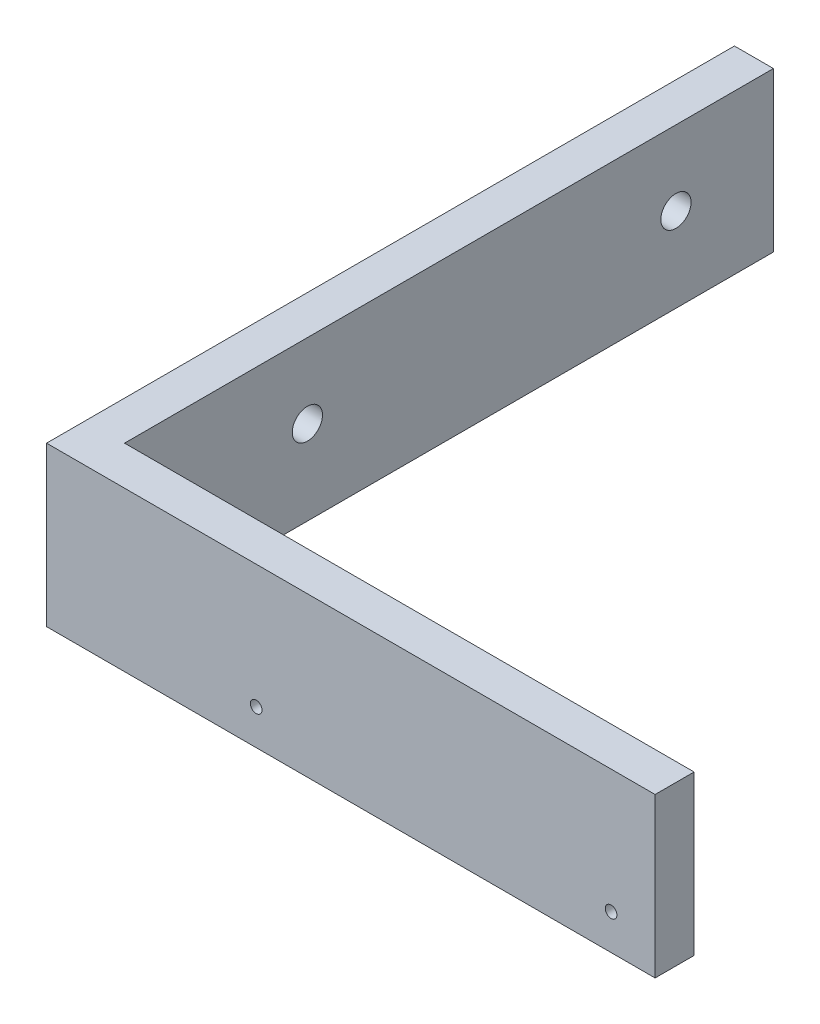
ISO-10303-21;
HEADER;
FILE_DESCRIPTION(('STEP AP214'),'2;1');
FILE_NAME('part.step','',(''),(''),'','','');
FILE_SCHEMA(('AUTOMOTIVE_DESIGN { 1 0 10303 214 1 1 1 1 }'));
ENDSEC;
DATA;
#1=APPLICATION_CONTEXT('core data for automotive mechanical design processes');
#2=APPLICATION_PROTOCOL_DEFINITION('international standard','automotive_design',2000,#1);
#3=PRODUCT_CONTEXT('',#1,'mechanical');
#4=PRODUCT('Part','Part','',(#3));
#5=PRODUCT_RELATED_PRODUCT_CATEGORY('part','',(#4));
#6=PRODUCT_DEFINITION_FORMATION('','',#4);
#7=PRODUCT_DEFINITION_CONTEXT('part definition',#1,'design');
#8=PRODUCT_DEFINITION('design','',#6,#7);
#9=PRODUCT_DEFINITION_SHAPE('','',#8);
#10=(LENGTH_UNIT() NAMED_UNIT(*) SI_UNIT(.MILLI.,.METRE.));
#11=(NAMED_UNIT(*) PLANE_ANGLE_UNIT() SI_UNIT($,.RADIAN.));
#12=(NAMED_UNIT(*) SI_UNIT($,.STERADIAN.) SOLID_ANGLE_UNIT());
#13=UNCERTAINTY_MEASURE_WITH_UNIT(LENGTH_MEASURE(1.E-05),#10,'distance_accuracy_value','');
#14=(GEOMETRIC_REPRESENTATION_CONTEXT(3) GLOBAL_UNCERTAINTY_ASSIGNED_CONTEXT((#13)) GLOBAL_UNIT_ASSIGNED_CONTEXT((#10,
#11,#12)) REPRESENTATION_CONTEXT('',''));
#15=CARTESIAN_POINT('',(0.,0.,0.));
#16=DIRECTION('',(0.,0.,1.));
#17=DIRECTION('',(1.,0.,0.));
#18=AXIS2_PLACEMENT_3D('',#15,#16,#17);
#19=CARTESIAN_POINT('',(-35.15,0.,4.));
#20=DIRECTION('',(1.,0.,0.));
#21=DIRECTION('',(0.,0.,-1.));
#22=AXIS2_PLACEMENT_3D('',#19,#20,#21);
#23=PLANE('',#22);
#24=DIRECTION('',(0.,0.,-1.));
#25=VECTOR('',#24,1.);
#26=CARTESIAN_POINT('',(-35.15,8.15,4.));
#27=LINE('',#26,#25);
#28=CARTESIAN_POINT('',(-35.15,8.15,4.));
#29=VERTEX_POINT('',#28);
#30=CARTESIAN_POINT('',(-35.15,8.14999999999999,-66.5500000000005));
#31=VERTEX_POINT('',#30);
#32=EDGE_CURVE('E116',#29,#31,#27,.T.);
#33=ORIENTED_EDGE('',*,*,#32,.T.);
#34=DIRECTION('',(0.,-1.,0.));
#35=VECTOR('',#34,1.);
#36=CARTESIAN_POINT('',(-35.15,8.14999999999999,-66.5500000000005));
#37=LINE('',#36,#35);
#38=CARTESIAN_POINT('',(-35.15,-8.15000000000001,-66.5500000000005));
#39=VERTEX_POINT('',#38);
#40=EDGE_CURVE('E146',#31,#39,#37,.T.);
#41=ORIENTED_EDGE('',*,*,#40,.T.);
#42=DIRECTION('',(0.,0.,-1.));
#43=VECTOR('',#42,1.);
#44=CARTESIAN_POINT('',(-35.15,-8.15,4.));
#45=LINE('',#44,#43);
#46=CARTESIAN_POINT('',(-35.15,-8.15,4.));
#47=VERTEX_POINT('',#46);
#48=EDGE_CURVE('E126',#47,#39,#45,.T.);
#49=ORIENTED_EDGE('',*,*,#48,.F.);
#50=DIRECTION('',(0.,-1.,0.));
#51=VECTOR('',#50,1.);
#52=CARTESIAN_POINT('',(-35.15,0.,4.));
#53=LINE('',#52,#51);
#54=EDGE_CURVE('E119',#29,#47,#53,.T.);
#55=ORIENTED_EDGE('',*,*,#54,.F.);
#56=EDGE_LOOP('',(#33,#41,#49,#55));
#57=FACE_BOUND('',#56,.T.);
#58=CARTESIAN_POINT('',(-35.15,0.499999999999778,-18.7500000000005));
#59=DIRECTION('',(-1.,0.,0.));
#60=DIRECTION('',(0.,0.,1.));
#61=AXIS2_PLACEMENT_3D('',#58,#59,#60);
#62=CIRCLE('',#61,1.55);
#63=CARTESIAN_POINT('',(-35.15,0.499999999999778,-17.2000000000005));
#64=VERTEX_POINT('',#63);
#65=EDGE_CURVE('E162',#64,#64,#62,.T.);
#66=ORIENTED_EDGE('',*,*,#65,.F.);
#67=EDGE_LOOP('',(#66));
#68=FACE_BOUND('',#67,.T.);
#69=CARTESIAN_POINT('',(-35.15,0.499999999999778,-56.5500000000005));
#70=DIRECTION('',(-1.,0.,0.));
#71=DIRECTION('',(0.,0.,1.));
#72=AXIS2_PLACEMENT_3D('',#69,#70,#71);
#73=CIRCLE('',#72,1.55);
#74=CARTESIAN_POINT('',(-35.15,0.499999999999778,-55.0000000000005));
#75=VERTEX_POINT('',#74);
#76=EDGE_CURVE('E156',#75,#75,#73,.T.);
#77=ORIENTED_EDGE('',*,*,#76,.F.);
#78=EDGE_LOOP('',(#77));
#79=FACE_BOUND('',#78,.T.);
#80=ADVANCED_FACE('F61',(#57,#68,#79),#23,.F.);
#81=CARTESIAN_POINT('',(27.2634,0.,4.));
#82=DIRECTION('',(-1.,0.,0.));
#83=DIRECTION('',(0.,0.,1.));
#84=AXIS2_PLACEMENT_3D('',#81,#82,#83);
#85=PLANE('',#84);
#86=DIRECTION('',(0.,1.,0.));
#87=VECTOR('',#86,1.);
#88=CARTESIAN_POINT('',(27.2634,0.,0.));
#89=LINE('',#88,#87);
#90=CARTESIAN_POINT('',(27.2634,-8.15,0.));
#91=VERTEX_POINT('',#90);
#92=CARTESIAN_POINT('',(27.2634,8.15000000000001,0.));
#93=VERTEX_POINT('',#92);
#94=EDGE_CURVE('E125',#91,#93,#89,.T.);
#95=ORIENTED_EDGE('',*,*,#94,.T.);
#96=DIRECTION('',(0.,0.,-1.));
#97=VECTOR('',#96,1.);
#98=CARTESIAN_POINT('',(27.2634,8.15000000000001,4.));
#99=LINE('',#98,#97);
#100=CARTESIAN_POINT('',(27.2634,8.15000000000001,4.));
#101=VERTEX_POINT('',#100);
#102=EDGE_CURVE('E70',#101,#93,#99,.T.);
#103=ORIENTED_EDGE('',*,*,#102,.F.);
#104=DIRECTION('',(0.,1.,0.));
#105=VECTOR('',#104,1.);
#106=CARTESIAN_POINT('',(27.2634,0.,4.));
#107=LINE('',#106,#105);
#108=CARTESIAN_POINT('',(27.2634,-8.15,4.));
#109=VERTEX_POINT('',#108);
#110=EDGE_CURVE('E120',#109,#101,#107,.T.);
#111=ORIENTED_EDGE('',*,*,#110,.F.);
#112=DIRECTION('',(0.,0.,-1.));
#113=VECTOR('',#112,1.);
#114=CARTESIAN_POINT('',(27.2634,-8.15,4.));
#115=LINE('',#114,#113);
#116=EDGE_CURVE('E12',#109,#91,#115,.T.);
#117=ORIENTED_EDGE('',*,*,#116,.T.);
#118=EDGE_LOOP('',(#95,#103,#111,#117));
#119=FACE_BOUND('',#118,.T.);
#120=ADVANCED_FACE('F124',(#119),#85,.F.);
#121=CARTESIAN_POINT('',(0.,8.15,4.));
#122=DIRECTION('',(0.,1.,0.));
#123=DIRECTION('',(-1.,0.,0.));
#124=AXIS2_PLACEMENT_3D('',#121,#122,#123);
#125=PLANE('',#124);
#126=DIRECTION('',(1.,0.,0.));
#127=VECTOR('',#126,1.);
#128=CARTESIAN_POINT('',(0.,8.15,0.));
#129=LINE('',#128,#127);
#130=CARTESIAN_POINT('',(-31.15,8.15,0.));
#131=VERTEX_POINT('',#130);
#132=EDGE_CURVE('E130',#131,#93,#129,.T.);
#133=ORIENTED_EDGE('',*,*,#132,.F.);
#134=DIRECTION('',(0.,0.,-1.));
#135=VECTOR('',#134,1.);
#136=CARTESIAN_POINT('',(-31.15,8.15,4.));
#137=LINE('',#136,#135);
#138=CARTESIAN_POINT('',(-31.15,8.14999999999999,-66.5500000000005));
#139=VERTEX_POINT('',#138);
#140=EDGE_CURVE('E99',#131,#139,#137,.T.);
#141=ORIENTED_EDGE('',*,*,#140,.T.);
#142=DIRECTION('',(-1.,0.,0.));
#143=VECTOR('',#142,1.);
#144=CARTESIAN_POINT('',(-31.15,8.14999999999999,-66.5500000000005));
#145=LINE('',#144,#143);
#146=EDGE_CURVE('E141',#139,#31,#145,.T.);
#147=ORIENTED_EDGE('',*,*,#146,.T.);
#148=ORIENTED_EDGE('',*,*,#32,.F.);
#149=DIRECTION('',(1.,0.,0.));
#150=VECTOR('',#149,1.);
#151=CARTESIAN_POINT('',(0.,8.15,4.));
#152=LINE('',#151,#150);
#153=EDGE_CURVE('E109',#29,#101,#152,.T.);
#154=ORIENTED_EDGE('',*,*,#153,.T.);
#155=ORIENTED_EDGE('',*,*,#102,.T.);
#156=EDGE_LOOP('',(#133,#141,#147,#148,#154,#155));
#157=FACE_BOUND('',#156,.T.);
#158=ADVANCED_FACE('F112',(#157),#125,.T.);
#159=CARTESIAN_POINT('',(0.,-8.15,4.));
#160=DIRECTION('',(0.,-1.,0.));
#161=DIRECTION('',(1.,0.,0.));
#162=AXIS2_PLACEMENT_3D('',#159,#160,#161);
#163=PLANE('',#162);
#164=DIRECTION('',(-1.,0.,0.));
#165=VECTOR('',#164,1.);
#166=CARTESIAN_POINT('',(0.,-8.15,4.));
#167=LINE('',#166,#165);
#168=EDGE_CURVE('E78',#109,#47,#167,.T.);
#169=ORIENTED_EDGE('',*,*,#168,.T.);
#170=ORIENTED_EDGE('',*,*,#48,.T.);
#171=DIRECTION('',(-1.,0.,0.));
#172=VECTOR('',#171,1.);
#173=CARTESIAN_POINT('',(-31.15,-8.15000000000001,-66.5500000000005));
#174=LINE('',#173,#172);
#175=CARTESIAN_POINT('',(-31.15,-8.15000000000001,-66.5500000000005));
#176=VERTEX_POINT('',#175);
#177=EDGE_CURVE('E140',#176,#39,#174,.T.);
#178=ORIENTED_EDGE('',*,*,#177,.F.);
#179=DIRECTION('',(0.,0.,1.));
#180=VECTOR('',#179,1.);
#181=CARTESIAN_POINT('',(-31.15,-8.15,4.));
#182=LINE('',#181,#180);
#183=CARTESIAN_POINT('',(-31.15,-8.15,0.));
#184=VERTEX_POINT('',#183);
#185=EDGE_CURVE('E143',#176,#184,#182,.T.);
#186=ORIENTED_EDGE('',*,*,#185,.T.);
#187=DIRECTION('',(-1.,0.,0.));
#188=VECTOR('',#187,1.);
#189=CARTESIAN_POINT('',(0.,-8.15,0.));
#190=LINE('',#189,#188);
#191=EDGE_CURVE('E133',#91,#184,#190,.T.);
#192=ORIENTED_EDGE('',*,*,#191,.F.);
#193=ORIENTED_EDGE('',*,*,#116,.F.);
#194=EDGE_LOOP('',(#169,#170,#178,#186,#192,#193));
#195=FACE_BOUND('',#194,.T.);
#196=ADVANCED_FACE('F63',(#195),#163,.T.);
#197=CARTESIAN_POINT('',(0.,0.,0.));
#198=DIRECTION('',(0.,0.,1.));
#199=DIRECTION('',(1.,0.,0.));
#200=AXIS2_PLACEMENT_3D('',#197,#198,#199);
#201=PLANE('',#200);
#202=CARTESIAN_POINT('',(22.75,-4.52,0.));
#203=DIRECTION('',(0.,0.,-1.));
#204=DIRECTION('',(-1.,0.,0.));
#205=AXIS2_PLACEMENT_3D('',#202,#203,#204);
#206=CIRCLE('',#205,0.6);
#207=CARTESIAN_POINT('',(22.15,-4.52,0.));
#208=VERTEX_POINT('',#207);
#209=EDGE_CURVE('E165',#208,#208,#206,.T.);
#210=ORIENTED_EDGE('',*,*,#209,.F.);
#211=EDGE_LOOP('',(#210));
#212=FACE_BOUND('',#211,.T.);
#213=CARTESIAN_POINT('',(-13.65,-4.52,0.));
#214=DIRECTION('',(0.,0.,-1.));
#215=DIRECTION('',(-1.,0.,0.));
#216=AXIS2_PLACEMENT_3D('',#213,#214,#215);
#217=CIRCLE('',#216,0.6);
#218=CARTESIAN_POINT('',(-14.25,-4.52,0.));
#219=VERTEX_POINT('',#218);
#220=EDGE_CURVE('E171',#219,#219,#217,.T.);
#221=ORIENTED_EDGE('',*,*,#220,.F.);
#222=EDGE_LOOP('',(#221));
#223=FACE_BOUND('',#222,.T.);
#224=ORIENTED_EDGE('',*,*,#191,.T.);
#225=DIRECTION('',(0.,1.,0.));
#226=VECTOR('',#225,1.);
#227=CARTESIAN_POINT('',(-31.15,0.,0.));
#228=LINE('',#227,#226);
#229=EDGE_CURVE('E136',#184,#131,#228,.T.);
#230=ORIENTED_EDGE('',*,*,#229,.T.);
#231=ORIENTED_EDGE('',*,*,#132,.T.);
#232=ORIENTED_EDGE('',*,*,#94,.F.);
#233=EDGE_LOOP('',(#224,#230,#231,#232));
#234=FACE_BOUND('',#233,.T.);
#235=ADVANCED_FACE('F182',(#212,#223,#234),#201,.F.);
#236=CARTESIAN_POINT('',(0.,0.,4.));
#237=DIRECTION('',(0.,0.,1.));
#238=DIRECTION('',(1.,0.,0.));
#239=AXIS2_PLACEMENT_3D('',#236,#237,#238);
#240=PLANE('',#239);
#241=CARTESIAN_POINT('',(22.75,-4.52,4.));
#242=DIRECTION('',(0.,0.,1.));
#243=DIRECTION('',(1.,0.,0.));
#244=AXIS2_PLACEMENT_3D('',#241,#242,#243);
#245=CIRCLE('',#244,0.6);
#246=CARTESIAN_POINT('',(23.35,-4.52,4.));
#247=VERTEX_POINT('',#246);
#248=EDGE_CURVE('E174',#247,#247,#245,.F.);
#249=ORIENTED_EDGE('',*,*,#248,.T.);
#250=EDGE_LOOP('',(#249));
#251=FACE_BOUND('',#250,.T.);
#252=CARTESIAN_POINT('',(-13.65,-4.52,4.));
#253=DIRECTION('',(0.,0.,1.));
#254=DIRECTION('',(1.,0.,0.));
#255=AXIS2_PLACEMENT_3D('',#252,#253,#254);
#256=CIRCLE('',#255,0.6);
#257=CARTESIAN_POINT('',(-13.05,-4.52,4.));
#258=VERTEX_POINT('',#257);
#259=EDGE_CURVE('E168',#258,#258,#256,.F.);
#260=ORIENTED_EDGE('',*,*,#259,.T.);
#261=EDGE_LOOP('',(#260));
#262=FACE_BOUND('',#261,.T.);
#263=ORIENTED_EDGE('',*,*,#110,.T.);
#264=ORIENTED_EDGE('',*,*,#153,.F.);
#265=ORIENTED_EDGE('',*,*,#54,.T.);
#266=ORIENTED_EDGE('',*,*,#168,.F.);
#267=EDGE_LOOP('',(#263,#264,#265,#266));
#268=FACE_BOUND('',#267,.T.);
#269=ADVANCED_FACE('F122',(#251,#262,#268),#240,.T.);
#270=CARTESIAN_POINT('',(-31.15,0.,0.));
#271=DIRECTION('',(1.,0.,0.));
#272=DIRECTION('',(0.,0.,-1.));
#273=AXIS2_PLACEMENT_3D('',#270,#271,#272);
#274=PLANE('',#273);
#275=CARTESIAN_POINT('',(-31.15,0.499999999999778,-56.5500000000005));
#276=DIRECTION('',(-1.,0.,0.));
#277=DIRECTION('',(0.,0.,1.));
#278=AXIS2_PLACEMENT_3D('',#275,#276,#277);
#279=CIRCLE('',#278,1.55);
#280=CARTESIAN_POINT('',(-31.15,0.499999999999778,-55.0000000000005));
#281=VERTEX_POINT('',#280);
#282=EDGE_CURVE('E149',#281,#281,#279,.T.);
#283=ORIENTED_EDGE('',*,*,#282,.T.);
#284=EDGE_LOOP('',(#283));
#285=FACE_BOUND('',#284,.T.);
#286=CARTESIAN_POINT('',(-31.15,0.499999999999778,-18.7500000000005));
#287=DIRECTION('',(-1.,0.,0.));
#288=DIRECTION('',(0.,0.,1.));
#289=AXIS2_PLACEMENT_3D('',#286,#287,#288);
#290=CIRCLE('',#289,1.55);
#291=CARTESIAN_POINT('',(-31.15,0.499999999999778,-17.2000000000005));
#292=VERTEX_POINT('',#291);
#293=EDGE_CURVE('E159',#292,#292,#290,.T.);
#294=ORIENTED_EDGE('',*,*,#293,.T.);
#295=EDGE_LOOP('',(#294));
#296=FACE_BOUND('',#295,.T.);
#297=ORIENTED_EDGE('',*,*,#229,.F.);
#298=ORIENTED_EDGE('',*,*,#185,.F.);
#299=DIRECTION('',(0.,-1.,0.));
#300=VECTOR('',#299,1.);
#301=CARTESIAN_POINT('',(-31.15,8.14999999999999,-66.5500000000005));
#302=LINE('',#301,#300);
#303=EDGE_CURVE('E152',#139,#176,#302,.T.);
#304=ORIENTED_EDGE('',*,*,#303,.F.);
#305=ORIENTED_EDGE('',*,*,#140,.F.);
#306=EDGE_LOOP('',(#297,#298,#304,#305));
#307=FACE_BOUND('',#306,.T.);
#308=ADVANCED_FACE('F191',(#285,#296,#307),#274,.T.);
#309=CARTESIAN_POINT('',(-31.15,8.14999999999999,-66.5500000000005));
#310=DIRECTION('',(0.,0.,-1.));
#311=DIRECTION('',(-1.,0.,0.));
#312=AXIS2_PLACEMENT_3D('',#309,#310,#311);
#313=PLANE('',#312);
#314=ORIENTED_EDGE('',*,*,#40,.F.);
#315=ORIENTED_EDGE('',*,*,#146,.F.);
#316=ORIENTED_EDGE('',*,*,#303,.T.);
#317=ORIENTED_EDGE('',*,*,#177,.T.);
#318=EDGE_LOOP('',(#314,#315,#316,#317));
#319=FACE_BOUND('',#318,.T.);
#320=ADVANCED_FACE('F202',(#319),#313,.T.);
#321=CARTESIAN_POINT('',(-31.15,0.499999999999778,-56.5500000000005));
#322=DIRECTION('',(-1.,0.,0.));
#323=DIRECTION('',(0.,0.,1.));
#324=AXIS2_PLACEMENT_3D('',#321,#322,#323);
#325=CYLINDRICAL_SURFACE('',#324,1.55);
#326=ORIENTED_EDGE('',*,*,#282,.F.);
#327=EDGE_LOOP('',(#326));
#328=FACE_BOUND('',#327,.T.);
#329=ORIENTED_EDGE('',*,*,#76,.T.);
#330=EDGE_LOOP('',(#329));
#331=FACE_BOUND('',#330,.T.);
#332=ADVANCED_FACE('F211',(#328,#331),#325,.F.);
#333=CARTESIAN_POINT('',(-31.15,0.499999999999778,-18.7500000000005));
#334=DIRECTION('',(-1.,0.,0.));
#335=DIRECTION('',(0.,0.,1.));
#336=AXIS2_PLACEMENT_3D('',#333,#334,#335);
#337=CYLINDRICAL_SURFACE('',#336,1.55);
#338=ORIENTED_EDGE('',*,*,#293,.F.);
#339=EDGE_LOOP('',(#338));
#340=FACE_BOUND('',#339,.T.);
#341=ORIENTED_EDGE('',*,*,#65,.T.);
#342=EDGE_LOOP('',(#341));
#343=FACE_BOUND('',#342,.T.);
#344=ADVANCED_FACE('F213',(#340,#343),#337,.F.);
#345=CARTESIAN_POINT('',(-13.65,-4.52,4.001));
#346=DIRECTION('',(0.,0.,-1.));
#347=DIRECTION('',(-1.,0.,0.));
#348=AXIS2_PLACEMENT_3D('',#345,#346,#347);
#349=CYLINDRICAL_SURFACE('',#348,0.6);
#350=ORIENTED_EDGE('',*,*,#259,.F.);
#351=EDGE_LOOP('',(#350));
#352=FACE_BOUND('',#351,.T.);
#353=ORIENTED_EDGE('',*,*,#220,.T.);
#354=EDGE_LOOP('',(#353));
#355=FACE_BOUND('',#354,.T.);
#356=ADVANCED_FACE('F220',(#352,#355),#349,.F.);
#357=CARTESIAN_POINT('',(22.75,-4.52,4.001));
#358=DIRECTION('',(0.,0.,-1.));
#359=DIRECTION('',(-1.,0.,0.));
#360=AXIS2_PLACEMENT_3D('',#357,#358,#359);
#361=CYLINDRICAL_SURFACE('',#360,0.6);
#362=ORIENTED_EDGE('',*,*,#248,.F.);
#363=EDGE_LOOP('',(#362));
#364=FACE_BOUND('',#363,.T.);
#365=ORIENTED_EDGE('',*,*,#209,.T.);
#366=EDGE_LOOP('',(#365));
#367=FACE_BOUND('',#366,.T.);
#368=ADVANCED_FACE('F180',(#364,#367),#361,.F.);
#369=CLOSED_SHELL('',(#80,#120,#158,#196,#235,#269,#308,#320,#332,#344,#356,#368));
#370=MANIFOLD_SOLID_BREP('B2',#369);
#371=ADVANCED_BREP_SHAPE_REPRESENTATION('',(#18,#370),#14);
#372=SHAPE_DEFINITION_REPRESENTATION(#9,#371);
ENDSEC;
END-ISO-10303-21;
